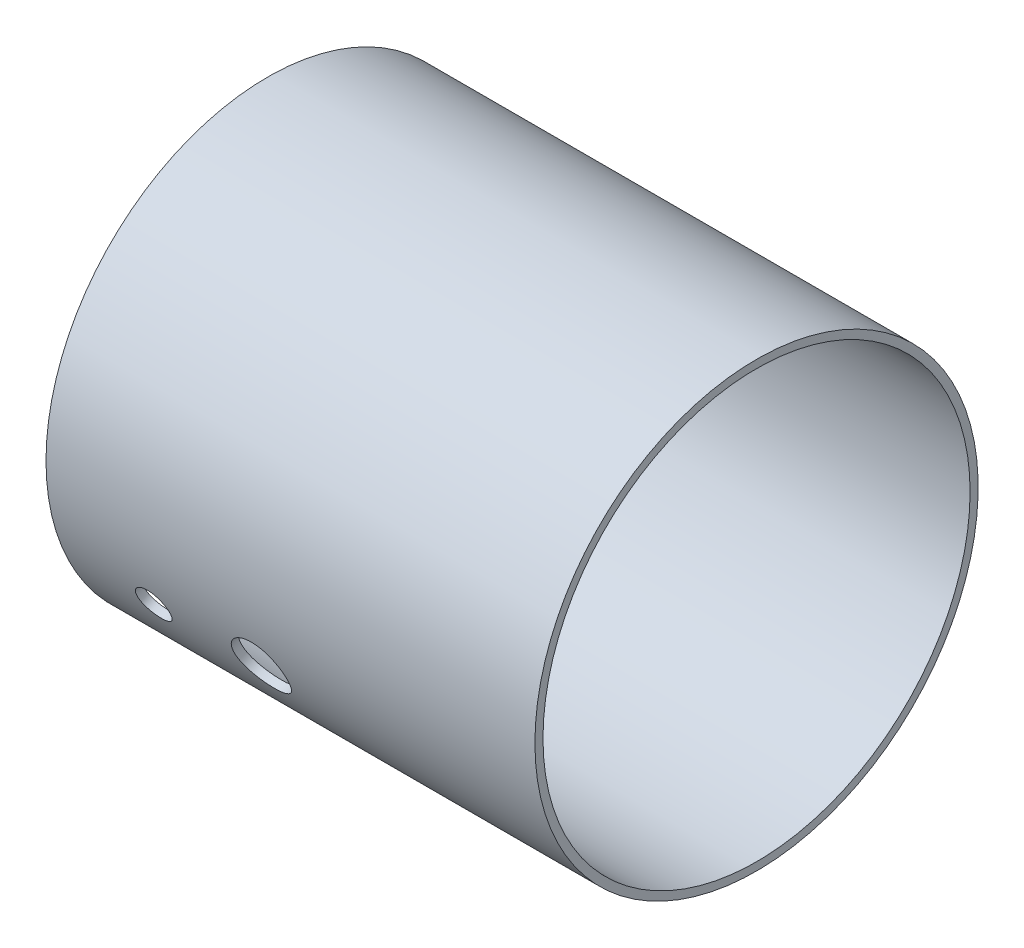
ISO-10303-21;
HEADER;
FILE_DESCRIPTION(('STEP AP214'),'2;1');
FILE_NAME('part.step','',(''),(''),'','','');
FILE_SCHEMA(('AUTOMOTIVE_DESIGN { 1 0 10303 214 1 1 1 1 }'));
ENDSEC;
DATA;
#1=APPLICATION_CONTEXT('core data for automotive mechanical design processes');
#2=APPLICATION_PROTOCOL_DEFINITION('international standard','automotive_design',2000,#1);
#3=PRODUCT_CONTEXT('',#1,'mechanical');
#4=PRODUCT('Part','Part','',(#3));
#5=PRODUCT_RELATED_PRODUCT_CATEGORY('part','',(#4));
#6=PRODUCT_DEFINITION_FORMATION('','',#4);
#7=PRODUCT_DEFINITION_CONTEXT('part definition',#1,'design');
#8=PRODUCT_DEFINITION('design','',#6,#7);
#9=PRODUCT_DEFINITION_SHAPE('','',#8);
#10=(LENGTH_UNIT() NAMED_UNIT(*) SI_UNIT(.MILLI.,.METRE.));
#11=(NAMED_UNIT(*) PLANE_ANGLE_UNIT() SI_UNIT($,.RADIAN.));
#12=(NAMED_UNIT(*) SI_UNIT($,.STERADIAN.) SOLID_ANGLE_UNIT());
#13=UNCERTAINTY_MEASURE_WITH_UNIT(LENGTH_MEASURE(1.E-05),#10,'distance_accuracy_value','');
#14=(GEOMETRIC_REPRESENTATION_CONTEXT(3) GLOBAL_UNCERTAINTY_ASSIGNED_CONTEXT((#13)) GLOBAL_UNIT_ASSIGNED_CONTEXT((#10,
#11,#12)) REPRESENTATION_CONTEXT('',''));
#15=CARTESIAN_POINT('',(0.,0.,0.));
#16=DIRECTION('',(0.,0.,1.));
#17=DIRECTION('',(1.,0.,0.));
#18=AXIS2_PLACEMENT_3D('',#15,#16,#17);
#19=CARTESIAN_POINT('',(-120.01793217917,0.,0.));
#20=DIRECTION('',(-1.,0.,0.));
#21=DIRECTION('',(0.,0.,1.));
#22=AXIS2_PLACEMENT_3D('',#19,#20,#21);
#23=CYLINDRICAL_SURFACE('',#22,79.5);
#24=CARTESIAN_POINT('',(182.,0.,0.));
#25=DIRECTION('',(-1.,0.,0.));
#26=DIRECTION('',(0.,0.,1.));
#27=AXIS2_PLACEMENT_3D('',#24,#25,#26);
#28=CIRCLE('',#27,79.5);
#29=CARTESIAN_POINT('',(182.,0.,79.5));
#30=VERTEX_POINT('',#29);
#31=EDGE_CURVE('E47',#30,#30,#28,.T.);
#32=ORIENTED_EDGE('',*,*,#31,.F.);
#33=EDGE_LOOP('',(#32));
#34=FACE_BOUND('',#33,.T.);
#35=CARTESIAN_POINT('',(0.,0.,0.));
#36=DIRECTION('',(-1.,0.,0.));
#37=DIRECTION('',(0.,0.,1.));
#38=AXIS2_PLACEMENT_3D('',#35,#36,#37);
#39=CIRCLE('',#38,79.5);
#40=CARTESIAN_POINT('',(0.,0.,79.5));
#41=VERTEX_POINT('',#40);
#42=EDGE_CURVE('E10',#41,#41,#39,.T.);
#43=ORIENTED_EDGE('',*,*,#42,.T.);
#44=EDGE_LOOP('',(#43));
#45=FACE_BOUND('',#44,.T.);
#46=CARTESIAN_POINT('',(33.0000000000002,-26.339565342706,75.0098480038277));
#47=CARTESIAN_POINT('',(33.1780990960392,-26.3395637631079,75.0098483234516));
#48=CARTESIAN_POINT('',(33.3561735519873,-26.3466607333371,75.0073575387973));
#49=CARTESIAN_POINT('',(33.7111118902623,-26.3749916611363,74.9974002817584));
#50=CARTESIAN_POINT('',(33.8879754610085,-26.3962291286621,74.9899325740011));
#51=CARTESIAN_POINT('',(34.2393184216277,-26.4527005304754,74.9700308625018));
#52=CARTESIAN_POINT('',(34.4137957046992,-26.487946098947,74.9575927306137));
#53=CARTESIAN_POINT('',(34.7590423343135,-26.5721679758415,74.9277777842344));
#54=CARTESIAN_POINT('',(34.9298102999027,-26.6211493066967,74.9103991632389));
#55=CARTESIAN_POINT('',(35.2662020689658,-26.7323978056422,74.8707712506039));
#56=CARTESIAN_POINT('',(35.4318305089475,-26.7946525751679,74.8485265038552));
#57=CARTESIAN_POINT('',(35.756999419303,-26.9320118281662,74.7992116417414));
#58=CARTESIAN_POINT('',(35.916537621898,-27.0071210421622,74.7721397497998));
#59=CARTESIAN_POINT('',(36.2282446842993,-27.1695403471367,74.7132754609648));
#60=CARTESIAN_POINT('',(36.3804178260089,-27.2568432313759,74.6814858516618));
#61=CARTESIAN_POINT('',(36.6764808492024,-27.4430442236708,74.613263930124));
#62=CARTESIAN_POINT('',(36.8203676452818,-27.5419466096858,74.5768299045699));
#63=CARTESIAN_POINT('',(37.0990279357938,-27.7507443953443,74.4993865802986));
#64=CARTESIAN_POINT('',(37.2337852167798,-27.8606585355086,74.4583694676272));
#65=CARTESIAN_POINT('',(37.4930112593986,-28.0905414370194,74.3719474091262));
#66=CARTESIAN_POINT('',(37.6174762009992,-28.2105138985668,74.3265408475815));
#67=CARTESIAN_POINT('',(37.8551448020757,-28.4595298325317,74.231549284308));
#68=CARTESIAN_POINT('',(37.968352109962,-28.5885703428564,74.1819656459858));
#69=CARTESIAN_POINT('',(38.1827903937638,-28.8548362943468,74.0788013623981));
#70=CARTESIAN_POINT('',(38.2840169342014,-28.9920647387164,74.0252192487266));
#71=CARTESIAN_POINT('',(38.4738173168941,-29.2737741742691,73.9142684338173));
#72=CARTESIAN_POINT('',(38.5623789111018,-29.4182620058702,73.856896144495));
#73=CARTESIAN_POINT('',(38.726130588582,-29.7133427722454,73.7386773540787));
#74=CARTESIAN_POINT('',(38.8013157127596,-29.8639379459093,73.6778295755052));
#75=CARTESIAN_POINT('',(38.9377078128981,-30.1700230892288,73.5530215477795));
#76=CARTESIAN_POINT('',(38.9989201231033,-30.3255111650947,73.4890624977327));
#77=CARTESIAN_POINT('',(39.106979273493,-30.6402906238045,73.358378788494));
#78=CARTESIAN_POINT('',(39.1538208159005,-30.799583385975,73.2916531196548));
#79=CARTESIAN_POINT('',(39.2719963574666,-31.2806151348121,73.0882579658533));
#80=CARTESIAN_POINT('',(39.3214259882023,-31.6065089234031,72.9479631331041));
#81=CARTESIAN_POINT('',(39.3600200520946,-32.2591611328966,72.6617075218771));
#82=CARTESIAN_POINT('',(39.3491855240794,-32.5859195387978,72.5157468411097));
#83=CARTESIAN_POINT('',(39.2677411084826,-33.2304912099966,72.2226381059058));
#84=CARTESIAN_POINT('',(39.1972676137627,-33.548323177665,72.0754935189524));
#85=CARTESIAN_POINT('',(38.9987368040019,-34.166951202184,71.7843049505259));
#86=CARTESIAN_POINT('',(38.8706789789791,-34.4677471081321,71.6402609965245));
#87=CARTESIAN_POINT('',(38.5604676951755,-35.0444995586685,71.3599053100595));
#88=CARTESIAN_POINT('',(38.3782530014024,-35.3204275224174,71.2236025394404));
#89=CARTESIAN_POINT('',(37.964943357704,-35.8397419930519,70.9637044699875));
#90=CARTESIAN_POINT('',(37.7338474981838,-36.0831278942478,70.8401094076862));
#91=CARTESIAN_POINT('',(37.2285666579649,-36.53164601846,70.6098627058923));
#92=CARTESIAN_POINT('',(36.9542631526665,-36.7366695198328,70.5032593448473));
#93=CARTESIAN_POINT('',(36.3707668416944,-37.1023075562753,70.3115320105905));
#94=CARTESIAN_POINT('',(36.0615740105371,-37.2629220589076,70.2264080530679));
#95=CARTESIAN_POINT('',(35.4169938650973,-37.5356126725107,70.0810372307082));
#96=CARTESIAN_POINT('',(35.0816036899676,-37.6476834735577,70.0207930873682));
#97=CARTESIAN_POINT('',(34.3941882254255,-37.8203590338976,69.9276780021309));
#98=CARTESIAN_POINT('',(34.0421632570953,-37.8809647861333,69.8948065321182));
#99=CARTESIAN_POINT('',(33.3325112409311,-37.9490457914985,69.8578660564154));
#100=CARTESIAN_POINT('',(32.9749023409247,-37.9566672546407,69.853717789246));
#101=CARTESIAN_POINT('',(32.2633195997267,-37.9189701218964,69.8741879881071));
#102=CARTESIAN_POINT('',(31.9093457274518,-37.8736519790823,69.8988062079457));
#103=CARTESIAN_POINT('',(31.2155556904357,-37.7313425923171,69.975726127508));
#104=CARTESIAN_POINT('',(30.8757214711428,-37.6344195697941,70.0279912775187));
#105=CARTESIAN_POINT('',(30.2192984928643,-37.3914321570582,70.1580336066324));
#106=CARTESIAN_POINT('',(29.9027100770876,-37.2453670414722,70.2358111623169));
#107=CARTESIAN_POINT('',(29.301006236715,-36.9074657847723,70.4139573530232));
#108=CARTESIAN_POINT('',(29.0159610568388,-36.7155303797096,70.5143749543667));
#109=CARTESIAN_POINT('',(28.4861447247059,-36.2909993397547,70.7337989043113));
#110=CARTESIAN_POINT('',(28.241374209797,-36.0584030615233,70.8528055470264));
#111=CARTESIAN_POINT('',(27.7984900341628,-35.5580252593456,71.1052417568787));
#112=CARTESIAN_POINT('',(27.6004840116602,-35.2901647306107,71.2387035862052));
#113=CARTESIAN_POINT('',(27.2574895079495,-34.7267637669536,71.5150344517637));
#114=CARTESIAN_POINT('',(27.1125005340849,-34.4312235892745,71.6579034005662));
#115=CARTESIAN_POINT('',(26.8798342286508,-33.8208970582072,71.9479740113309));
#116=CARTESIAN_POINT('',(26.7920900523433,-33.5061336234173,72.0951704093797));
#117=CARTESIAN_POINT('',(26.6762112728436,-32.8655490990919,72.3894299208992));
#118=CARTESIAN_POINT('',(26.6480756421724,-32.5397282002535,72.5364930366236));
#119=CARTESIAN_POINT('',(26.651117563786,-32.0505458762944,72.7533131795582));
#120=CARTESIAN_POINT('',(26.6596457968045,-31.8875498471016,72.824897724091));
#121=CARTESIAN_POINT('',(26.6916205803092,-31.5623331886902,72.9664337837344));
#122=CARTESIAN_POINT('',(26.7150616048534,-31.4001122946684,73.0363858937951));
#123=CARTESIAN_POINT('',(26.7767104916502,-31.0775504372601,73.1742213123495));
#124=CARTESIAN_POINT('',(26.8149237893291,-30.9172101882535,73.2421038494179));
#125=CARTESIAN_POINT('',(26.9058208263609,-30.5996776301527,73.3753320616873));
#126=CARTESIAN_POINT('',(26.9584992548417,-30.4424841883903,73.4406786579285));
#127=CARTESIAN_POINT('',(27.0779738730102,-30.1322859461452,73.5684952842261));
#128=CARTESIAN_POINT('',(27.1447745354317,-29.9792824900792,73.6309643952858));
#129=CARTESIAN_POINT('',(27.2919782981715,-29.6786926875176,73.7526371271066));
#130=CARTESIAN_POINT('',(27.372376407136,-29.5311043773349,73.8118419355921));
#131=CARTESIAN_POINT('',(27.5462503182698,-29.2423232977976,73.9267251326737));
#132=CARTESIAN_POINT('',(27.6397306298084,-29.1011327560312,73.9824022956536));
#133=CARTESIAN_POINT('',(27.8390491190915,-28.8262980377158,74.0899204444065));
#134=CARTESIAN_POINT('',(27.9448827746423,-28.6926511260816,74.1417628226974));
#135=CARTESIAN_POINT('',(28.1685274693609,-28.433451289354,74.2415530285917));
#136=CARTESIAN_POINT('',(28.2863737500718,-28.3079240545632,74.2894886088057));
#137=CARTESIAN_POINT('',(28.5328980739968,-28.066397157741,74.3810730631424));
#138=CARTESIAN_POINT('',(28.6615721326326,-27.9503940216592,74.4247235014787));
#139=CARTESIAN_POINT('',(28.9289644188099,-27.7286758454477,74.5076140842716));
#140=CARTESIAN_POINT('',(29.067688742049,-27.6229671417689,74.5468515146968));
#141=CARTESIAN_POINT('',(29.354080424556,-27.4227644881333,74.6207301822976));
#142=CARTESIAN_POINT('',(29.5017444646058,-27.3282664138962,74.6553731103022));
#143=CARTESIAN_POINT('',(29.8053440496595,-27.1509797575773,74.7200322837832));
#144=CARTESIAN_POINT('',(29.9612965252871,-27.0682165173213,74.750038528339));
#145=CARTESIAN_POINT('',(30.2800177733364,-26.9153134870297,74.8052304803821));
#146=CARTESIAN_POINT('',(30.4427840259777,-26.8451690804207,74.8304179510225));
#147=CARTESIAN_POINT('',(30.773893490301,-26.7180718743163,74.8758919307544));
#148=CARTESIAN_POINT('',(30.9422318573503,-26.6611079425192,74.8961825763591));
#149=CARTESIAN_POINT('',(31.2833588052983,-26.5607607707999,74.9318277910881));
#150=CARTESIAN_POINT('',(31.4561462534149,-26.5173741102539,74.9471836035084));
#151=CARTESIAN_POINT('',(31.8551756925454,-26.4340302833858,74.9766267646965));
#152=CARTESIAN_POINT('',(32.0825090839352,-26.3986420708291,74.9890813166293));
#153=CARTESIAN_POINT('',(32.5399086888493,-26.3514106491849,75.0056917196992));
#154=CARTESIAN_POINT('',(32.7699748957273,-26.3395673828467,75.0098475910151));
#155=CARTESIAN_POINT('',(33.0000000000002,-26.339565342706,75.0098480038277));
#156=B_SPLINE_CURVE_WITH_KNOTS('',3,(#46,#47,#48,#49,#50,#51,#52,#53,#54,#55,#56,#57,#58,#59,
#60,#61,#62,#63,#64,#65,#66,#67,#68,#69,#70,#71,#72,#73,#74,#75,#76,#77,#78,#79,#80,#81,#82,#83,
#84,#85,#86,#87,#88,#89,#90,#91,#92,#93,#94,#95,#96,#97,#98,#99,#100,#101,#102,#103,#104,#105,
#106,#107,#108,#109,#110,#111,#112,#113,#114,#115,#116,#117,#118,#119,#120,#121,#122,#123,#124,
#125,#126,#127,#128,#129,#130,#131,#132,#133,#134,#135,#136,#137,#138,#139,#140,#141,#142,#143,
#144,#145,#146,#147,#148,#149,#150,#151,#152,#153,#154,#155),.UNSPECIFIED.,.T.,.F.,(4,2,2,2,2,2,
2,2,2,2,2,2,2,2,2,2,2,2,2,2,2,2,2,2,2,2,2,2,2,2,2,2,2,2,2,2,2,2,2,2,2,2,2,2,2,2,2,2,2,2,2,2,2,2,
4),(0.,0.534096216068249,1.06832505500291,1.60299851868933,2.13786773929535,2.67223951665104,
3.20680837099547,3.74106260935773,4.27551450687686,4.81089194014471,5.34646719671105,
5.88186831274489,6.41746702717752,6.95358025685408,7.48989182894925,8.02599831569972,
8.56230220103951,9.6314477901735,10.7005749495288,11.7672636282901,12.8339617541093,
13.9018706103609,14.9697993403184,16.0407102696176,17.1116219811323,18.1826508041185,
19.2536589627034,20.3217104996567,21.3897528959847,22.4563868379419,23.5230365248857,
24.5920156976694,25.6610117854509,26.7324449198234,27.8038680977392,28.8740379250771,
29.9441893056287,30.4783500434018,31.0123129628627,31.5464725401299,32.0804362623472,
32.6145693533148,33.1485067984591,33.682628744551,34.2165557740204,34.7520969155946,
35.2874418349073,35.8231142153032,36.3585889119208,36.8952029263956,37.4316202207581,
37.9675827867253,38.5034102147109,39.1932275088758,39.883043125716),.UNSPECIFIED.);
#157=CARTESIAN_POINT('',(33.0000000000002,-26.339565342706,75.0098480038277));
#158=VERTEX_POINT('',#157);
#159=EDGE_CURVE('E67',#158,#158,#156,.T.);
#160=ORIENTED_EDGE('',*,*,#159,.F.);
#161=EDGE_LOOP('',(#160));
#162=FACE_BOUND('',#161,.T.);
#163=CARTESIAN_POINT('',(73.0000000000001,-22.4636112990738,76.2603184323546));
#164=CARTESIAN_POINT('',(73.2908440333992,-22.4636076186002,76.2603186963325));
#165=CARTESIAN_POINT('',(73.5816376489165,-22.475421323408,76.2568423757306));
#166=CARTESIAN_POINT('',(74.1612360159097,-22.5225697070572,76.2429307494915));
#167=CARTESIAN_POINT('',(74.4500403088614,-22.5579096365573,76.2324938903779));
#168=CARTESIAN_POINT('',(75.0237588923989,-22.6518560794304,76.2046311280473));
#169=CARTESIAN_POINT('',(75.308669424037,-22.7104836304115,76.1871989052009));
#170=CARTESIAN_POINT('',(75.872322038034,-22.8505002628887,76.1453214136557));
#171=CARTESIAN_POINT('',(76.1510639927321,-22.9318898149783,76.1208759999621));
#172=CARTESIAN_POINT('',(76.7002041967344,-23.1166712408734,76.0649644212271));
#173=CARTESIAN_POINT('',(76.9706083290552,-23.2200471749742,76.0335033416119));
#174=CARTESIAN_POINT('',(77.5013961338517,-23.4479733477474,75.9635224861747));
#175=CARTESIAN_POINT('',(77.7617796766781,-23.5725238602697,75.9250026190611));
#176=CARTESIAN_POINT('',(78.2706691380458,-23.8417503699105,75.8408914391128));
#177=CARTESIAN_POINT('',(78.519177189519,-23.9864227345934,75.7953014024284));
#178=CARTESIAN_POINT('',(79.0026533337046,-24.2947428755549,75.697038494138));
#179=CARTESIAN_POINT('',(79.2376213400533,-24.4583907728468,75.6443655773618));
#180=CARTESIAN_POINT('',(79.6936457208415,-24.8043071749154,75.5316463814133));
#181=CARTESIAN_POINT('',(79.9146190218711,-24.9866725831138,75.4715613681047));
#182=CARTESIAN_POINT('',(80.339709602815,-25.3678348211333,75.3442984878019));
#183=CARTESIAN_POINT('',(80.5438268114087,-25.5666317204711,75.2771205907993));
#184=CARTESIAN_POINT('',(80.9337948629668,-25.9791212916562,75.1357623237385));
#185=CARTESIAN_POINT('',(81.1196445744752,-26.1928148847785,75.0615815204901));
#186=CARTESIAN_POINT('',(81.4717552520092,-26.6334356717905,74.9063725635146));
#187=CARTESIAN_POINT('',(81.6380166657677,-26.8603625630272,74.8253445663677));
#188=CARTESIAN_POINT('',(81.9503475735272,-27.3265727794846,74.6563467503727));
#189=CARTESIAN_POINT('',(82.0963411176714,-27.5658981996164,74.5683526631861));
#190=CARTESIAN_POINT('',(82.3663598524721,-28.0543115822826,74.3859767932547));
#191=CARTESIAN_POINT('',(82.4903849726118,-28.3033995761511,74.2915949900072));
#192=CARTESIAN_POINT('',(82.7155545067896,-28.8094368456178,74.0968274557237));
#193=CARTESIAN_POINT('',(82.816699642239,-29.0663858730659,73.9964419141131));
#194=CARTESIAN_POINT('',(82.9953627446139,-29.5862087810022,73.7901377890044));
#195=CARTESIAN_POINT('',(83.0728808566071,-29.849082625102,73.6842192394832));
#196=CARTESIAN_POINT('',(83.2033330539782,-30.3772603793375,73.4680407195221));
#197=CARTESIAN_POINT('',(83.2564054546767,-30.6425417356642,73.3578091016287));
#198=CARTESIAN_POINT('',(83.3382199606585,-31.1750496518697,73.133096401218));
#199=CARTESIAN_POINT('',(83.3669621493231,-31.4422762050791,73.0186153332652));
#200=CARTESIAN_POINT('',(83.399898661356,-31.976710239525,72.7861587941327));
#201=CARTESIAN_POINT('',(83.4040939156661,-32.2439177211004,72.6681834556436));
#202=CARTESIAN_POINT('',(83.3879072204003,-32.776393361227,72.429573752238));
#203=CARTESIAN_POINT('',(83.3675253512558,-33.0416615261218,72.3089393960247));
#204=CARTESIAN_POINT('',(83.3025386504136,-33.5667587607644,72.0666761003829));
#205=CARTESIAN_POINT('',(83.2580828334327,-33.8266111829234,71.9450577667773));
#206=CARTESIAN_POINT('',(83.1453774113024,-34.340744171889,71.7010757138381));
#207=CARTESIAN_POINT('',(83.0771279190378,-34.5950247651241,71.5787119980436));
#208=CARTESIAN_POINT('',(82.9173367088881,-35.0963011790024,71.334265327983));
#209=CARTESIAN_POINT('',(82.8257946617906,-35.3432968966276,71.2121823777099));
#210=CARTESIAN_POINT('',(82.6200852235322,-35.8283703878768,70.9693697869226));
#211=CARTESIAN_POINT('',(82.5059177321579,-36.0664481219954,70.848640152405));
#212=CARTESIAN_POINT('',(82.2554117637436,-36.53283167283,70.6092849487063));
#213=CARTESIAN_POINT('',(82.1190093802861,-36.7611068526188,70.4906665711546));
#214=CARTESIAN_POINT('',(81.8252450437563,-37.2056950124273,70.2570233632009));
#215=CARTESIAN_POINT('',(81.6678830649842,-37.4220079777792,70.1419985372053));
#216=CARTESIAN_POINT('',(81.3333004198112,-37.8413381655342,69.9166631993616));
#217=CARTESIAN_POINT('',(81.1560789111962,-38.0443548234811,69.8063528877235));
#218=CARTESIAN_POINT('',(80.7830167016722,-38.4358450809562,69.5915632465786));
#219=CARTESIAN_POINT('',(80.5871759052205,-38.624318605849,69.4870839469974));
#220=CARTESIAN_POINT('',(80.1766947752138,-38.986942837715,69.2842823347932));
#221=CARTESIAN_POINT('',(79.9619245810232,-39.1609756514748,69.186012018183));
#222=CARTESIAN_POINT('',(79.5163566138906,-39.4920750622511,68.9975528997378));
#223=CARTESIAN_POINT('',(79.285558756096,-39.6491415694343,68.9073641406934));
#224=CARTESIAN_POINT('',(78.8095436388696,-39.9453619073277,68.7360701980717));
#225=CARTESIAN_POINT('',(78.5643262829934,-40.0845156182086,68.6549650752607));
#226=CARTESIAN_POINT('',(78.0611882889654,-40.3440689919326,68.5027644831228));
#227=CARTESIAN_POINT('',(77.8032676771066,-40.4644686935901,68.4316689930795));
#228=CARTESIAN_POINT('',(77.2764029112327,-40.6858399366759,68.3002856087156));
#229=CARTESIAN_POINT('',(77.0074532955876,-40.7868017078857,68.240003150457));
#230=CARTESIAN_POINT('',(76.4605570473094,-40.9686047321554,68.1310110638017));
#231=CARTESIAN_POINT('',(76.1826104040049,-41.0494459613492,68.0823014491322));
#232=CARTESIAN_POINT('',(75.6197180897739,-41.1905060862727,67.9970514587448));
#233=CARTESIAN_POINT('',(75.3347727228228,-41.2507258759615,67.9605105555036));
#234=CARTESIAN_POINT('',(74.7599232465584,-41.3501731195173,67.9000484200178));
#235=CARTESIAN_POINT('',(74.4700191697484,-41.3894007109292,67.8761271050873));
#236=CARTESIAN_POINT('',(73.8895052680405,-41.4464070698075,67.8413328967628));
#237=CARTESIAN_POINT('',(73.5989164834042,-41.4643421704698,67.8303649009744));
#238=CARTESIAN_POINT('',(73.0170027463713,-41.4791769040875,67.8212942983545));
#239=CARTESIAN_POINT('',(72.7256777975859,-41.476076640029,67.8231916285364));
#240=CARTESIAN_POINT('',(72.1443864665952,-41.4488603188831,67.8398277627499));
#241=CARTESIAN_POINT('',(71.8544200541938,-41.4247447311516,67.8545662799867));
#242=CARTESIAN_POINT('',(71.2779139025845,-41.3556476438994,67.8967012582395));
#243=CARTESIAN_POINT('',(70.9913741612158,-41.3106661575367,67.9240977112736));
#244=CARTESIAN_POINT('',(70.4248218006016,-41.2003207567509,67.9910855411478));
#245=CARTESIAN_POINT('',(70.1447888292278,-41.1350334595033,68.0306310707672));
#246=CARTESIAN_POINT('',(69.5921175482063,-40.9844198759799,68.1214727832802));
#247=CARTESIAN_POINT('',(69.3194792139945,-40.8990936562799,68.1727689271344));
#248=CARTESIAN_POINT('',(68.7834885596779,-40.708912628979,68.2865045231278));
#249=CARTESIAN_POINT('',(68.5201365146073,-40.6040572435546,68.3489443049795));
#250=CARTESIAN_POINT('',(68.0045467504253,-40.3754448057649,68.4842397106149));
#251=CARTESIAN_POINT('',(67.7523090974672,-40.251687640915,68.5570953963836));
#252=CARTESIAN_POINT('',(67.2592618192434,-39.9852377455851,68.7128423364831));
#253=CARTESIAN_POINT('',(67.0185265484495,-39.8424398563349,68.795789081387));
#254=CARTESIAN_POINT('',(66.5517172508796,-39.5393179313399,68.9704496367401));
#255=CARTESIAN_POINT('',(66.3256432735398,-39.3789938365037,69.0621634767483));
#256=CARTESIAN_POINT('',(65.889709170444,-39.0417705446223,69.2533588412041));
#257=CARTESIAN_POINT('',(65.6798496678545,-38.8648707111038,69.3528406639013));
#258=CARTESIAN_POINT('',(65.2778058809309,-38.4955630991233,69.5585097747991));
#259=CARTESIAN_POINT('',(65.0856216295711,-38.3031552917314,69.6646970755084));
#260=CARTESIAN_POINT('',(64.7191180621286,-37.9027444582313,69.8833621914351));
#261=CARTESIAN_POINT('',(64.5449183984438,-37.6946511596439,69.9958752941739));
#262=CARTESIAN_POINT('',(64.217008274181,-37.2652377779264,70.2254321111829));
#263=CARTESIAN_POINT('',(64.0632979122398,-37.0439176311288,70.3424758472604));
#264=CARTESIAN_POINT('',(63.777474247272,-36.5894596285133,70.5799345545292));
#265=CARTESIAN_POINT('',(63.6453606169056,-36.3563219518828,70.7003494745913));
#266=CARTESIAN_POINT('',(63.403690724441,-35.8797394452116,70.9433988302161));
#267=CARTESIAN_POINT('',(63.2941343587943,-35.6362946624915,71.0660332555875));
#268=CARTESIAN_POINT('',(63.0986732952354,-35.1414381231724,71.3120287568477));
#269=CARTESIAN_POINT('',(63.0127005114497,-34.890051688353,71.4353866679746));
#270=CARTESIAN_POINT('',(62.864623965555,-34.3803386989011,71.6820931016104));
#271=CARTESIAN_POINT('',(62.8025201740465,-34.1220121528172,71.8054416241307));
#272=CARTESIAN_POINT('',(62.7026506493377,-33.6002167782707,72.0510831101523));
#273=CARTESIAN_POINT('',(62.6648839034897,-33.3367481642362,72.1733761173639));
#274=CARTESIAN_POINT('',(62.6139707625336,-32.8065189594951,72.4159326651279));
#275=CARTESIAN_POINT('',(62.6008242341008,-32.5397583866233,72.5361962166668));
#276=CARTESIAN_POINT('',(62.599256780732,-32.0068616681684,72.7729013795744));
#277=CARTESIAN_POINT('',(62.6106518668419,-31.7407357466471,72.8893648318616));
#278=CARTESIAN_POINT('',(62.6577079255579,-31.2090410898496,73.1185993215889));
#279=CARTESIAN_POINT('',(62.6933687687535,-30.9434723516095,73.2313703787173));
#280=CARTESIAN_POINT('',(62.7886897401382,-30.4148216499159,73.4525065718073));
#281=CARTESIAN_POINT('',(62.8483497707414,-30.1517396763552,73.5608717256821));
#282=CARTESIAN_POINT('',(62.9912270237788,-29.629988198685,73.7725766568043));
#283=CARTESIAN_POINT('',(63.0744442953707,-29.3713187037844,73.8759164235645));
#284=CARTESIAN_POINT('',(63.2637848320342,-28.8604102155754,74.0770009085013));
#285=CARTESIAN_POINT('',(63.3698982327129,-28.6081685051335,74.1747480133045));
#286=CARTESIAN_POINT('',(63.6042840300186,-28.1118683819148,74.3642617300358));
#287=CARTESIAN_POINT('',(63.7325564046689,-27.8678099610223,74.4560283478951));
#288=CARTESIAN_POINT('',(64.010314735207,-27.3897436023094,74.6332159802386));
#289=CARTESIAN_POINT('',(64.1597961345909,-27.1557335197545,74.7186383517182));
#290=CARTESIAN_POINT('',(64.4790119384055,-26.6993562488208,74.8829301762971));
#291=CARTESIAN_POINT('',(64.6487554204927,-26.47699434364,74.9617966652377));
#292=CARTESIAN_POINT('',(65.0085439803944,-26.0441580650025,75.1132797215272));
#293=CARTESIAN_POINT('',(65.1987256524889,-25.8337801525401,75.1858475223713));
#294=CARTESIAN_POINT('',(65.5969638671107,-25.4283597323844,75.3239296165825));
#295=CARTESIAN_POINT('',(65.8050128278809,-25.2333107866705,75.3894468754263));
#296=CARTESIAN_POINT('',(66.2377074564538,-24.8598859990912,75.5134080870349));
#297=CARTESIAN_POINT('',(66.462360644471,-24.6815177959707,75.5718488027585));
#298=CARTESIAN_POINT('',(66.9266168593646,-24.342970671296,75.6815793584701));
#299=CARTESIAN_POINT('',(67.1662196963775,-24.18279151881,75.7328692892476));
#300=CARTESIAN_POINT('',(67.6597624403987,-23.8812686924017,75.8284916064946));
#301=CARTESIAN_POINT('',(67.9137590190278,-23.7400080723627,75.8727934567589));
#302=CARTESIAN_POINT('',(68.4333591590815,-23.4782991869255,75.9541852380191));
#303=CARTESIAN_POINT('',(68.6989625589294,-23.3578506319213,75.9912752693706));
#304=CARTESIAN_POINT('',(69.2396490718723,-23.1388800364554,76.0582365257401));
#305=CARTESIAN_POINT('',(69.5147229305372,-23.0403372549614,76.0881145815908));
#306=CARTESIAN_POINT('',(70.0725287233958,-22.8658980335717,76.1407183038097));
#307=CARTESIAN_POINT('',(70.3552588528389,-22.7899963065058,76.1634456400918));
#308=CARTESIAN_POINT('',(71.0270291555607,-22.6388410031055,76.2085379344856));
#309=CARTESIAN_POINT('',(71.4184751346575,-22.573210731727,76.2279621629534));
#310=CARTESIAN_POINT('',(72.2066453609022,-22.485598577596,76.2538521759847));
#311=CARTESIAN_POINT('',(72.603369562476,-22.463616318217,76.2603180723621));
#312=CARTESIAN_POINT('',(73.0000000000001,-22.4636112990738,76.2603184323546));
#313=B_SPLINE_CURVE_WITH_KNOTS('',3,(#163,#164,#165,#166,#167,#168,#169,#170,#171,#172,#173,
#174,#175,#176,#177,#178,#179,#180,#181,#182,#183,#184,#185,#186,#187,#188,#189,#190,#191,#192,
#193,#194,#195,#196,#197,#198,#199,#200,#201,#202,#203,#204,#205,#206,#207,#208,#209,#210,#211,
#212,#213,#214,#215,#216,#217,#218,#219,#220,#221,#222,#223,#224,#225,#226,#227,#228,#229,#230,
#231,#232,#233,#234,#235,#236,#237,#238,#239,#240,#241,#242,#243,#244,#245,#246,#247,#248,#249,
#250,#251,#252,#253,#254,#255,#256,#257,#258,#259,#260,#261,#262,#263,#264,#265,#266,#267,#268,
#269,#270,#271,#272,#273,#274,#275,#276,#277,#278,#279,#280,#281,#282,#283,#284,#285,#286,#287,
#288,#289,#290,#291,#292,#293,#294,#295,#296,#297,#298,#299,#300,#301,#302,#303,#304,#305,#306,
#307,#308,#309,#310,#311,#312),.UNSPECIFIED.,.T.,.F.,(4,2,2,2,2,2,2,2,2,2,2,2,2,2,2,2,2,2,2,2,2,
2,2,2,2,2,2,2,2,2,2,2,2,2,2,2,2,2,2,2,2,2,2,2,2,2,2,2,2,2,2,2,2,2,2,2,2,2,2,2,2,2,2,2,2,2,2,2,2,
2,2,2,2,2,4),(0.,0.872184867165447,1.74456445664867,2.6177339366957,3.49092147044131,
4.36347810482662,5.23604602481505,6.10845663111056,6.98087280136404,7.85805824708721,
8.73524740411602,9.61249085847218,10.4897142576378,11.3701409291512,12.2505704267111,
13.1309721602557,14.0113684881063,14.8867203682008,15.7620692483964,16.6373849308037,
17.5126977486507,18.3826534089978,19.2526049420532,20.1225687715215,20.9925364543524,
21.8650501301429,22.7375648757805,23.6101166375272,24.4826728769162,25.361766695942,
26.2408651693639,27.1199695232874,27.9990720577415,28.8786153144081,29.7581596143477,
30.6376657803805,31.5171661836585,32.3901683985628,33.2631663393835,34.1361447831837,
35.0091226764857,35.878845841403,36.7485661168532,37.618312129427,38.4880633180678,
39.3628340039766,40.2376076393575,41.112414877967,41.9872237485499,42.867521292114,
43.7478230733352,44.6281115106597,45.5083959069603,46.3861115129261,47.2638260378011,
48.1415040392167,49.0191772877694,49.8902935198113,50.7614051061865,51.6325131504721,
52.5036230125415,53.374358319023,54.2450927619371,55.1156404204844,55.9865795690565,
56.8637515646958,57.7405531654771,58.6177543407287,59.4949443776088,60.3758672434942,
61.2567778500893,62.136850797956,63.0167180687966,64.2061461152958,65.3955638985071),.UNSPECIFIED.);
#314=CARTESIAN_POINT('',(73.0000000000001,-22.4636112990738,76.2603184323546));
#315=VERTEX_POINT('',#314);
#316=EDGE_CURVE('E60',#315,#315,#313,.T.);
#317=ORIENTED_EDGE('',*,*,#316,.F.);
#318=EDGE_LOOP('',(#317));
#319=FACE_BOUND('',#318,.T.);
#320=ADVANCED_FACE('F40',(#34,#45,#162,#319),#23,.F.);
#321=CARTESIAN_POINT('',(-120.01793217917,0.,0.));
#322=DIRECTION('',(-1.,0.,0.));
#323=DIRECTION('',(0.,0.,1.));
#324=AXIS2_PLACEMENT_3D('',#321,#322,#323);
#325=CYLINDRICAL_SURFACE('',#324,82.5);
#326=CARTESIAN_POINT('',(0.,0.,0.));
#327=DIRECTION('',(-1.,0.,0.));
#328=DIRECTION('',(0.,0.,1.));
#329=AXIS2_PLACEMENT_3D('',#326,#327,#328);
#330=CIRCLE('',#329,82.5);
#331=CARTESIAN_POINT('',(0.,0.,82.5));
#332=VERTEX_POINT('',#331);
#333=EDGE_CURVE('E55',#332,#332,#330,.T.);
#334=ORIENTED_EDGE('',*,*,#333,.F.);
#335=EDGE_LOOP('',(#334));
#336=FACE_BOUND('',#335,.T.);
#337=CARTESIAN_POINT('',(182.,0.,0.));
#338=DIRECTION('',(-1.,0.,0.));
#339=DIRECTION('',(0.,0.,1.));
#340=AXIS2_PLACEMENT_3D('',#337,#338,#339);
#341=CIRCLE('',#340,82.5);
#342=CARTESIAN_POINT('',(182.,0.,82.5));
#343=VERTEX_POINT('',#342);
#344=EDGE_CURVE('E51',#343,#343,#341,.T.);
#345=ORIENTED_EDGE('',*,*,#344,.T.);
#346=EDGE_LOOP('',(#345));
#347=FACE_BOUND('',#346,.T.);
#348=CARTESIAN_POINT('',(33.0000000000002,-27.5601821817878,77.7604421161986));
#349=CARTESIAN_POINT('',(33.1781209815815,-27.5601806289933,77.7604424427568));
#350=CARTESIAN_POINT('',(33.3562175828737,-27.5672703973049,77.7579309120473));
#351=CARTESIAN_POINT('',(33.7112003701421,-27.5955729152458,77.7478912223093));
#352=CARTESIAN_POINT('',(33.8880862431998,-27.6167891863054,77.7403618124321));
#353=CARTESIAN_POINT('',(34.2394747142756,-27.6732052062141,77.7202972626823));
#354=CARTESIAN_POINT('',(34.4139751948426,-27.7084166377547,77.707757940657));
#355=CARTESIAN_POINT('',(34.7592680980599,-27.7925587256669,77.6777038429724));
#356=CARTESIAN_POINT('',(34.9300591398166,-27.8414943998754,77.660187247499));
#357=CARTESIAN_POINT('',(35.2664975257244,-27.9526423684748,77.6202503558377));
#358=CARTESIAN_POINT('',(35.4321494766249,-28.0148423540693,77.59783460541));
#359=CARTESIAN_POINT('',(35.7573641356019,-28.1520847772607,77.5481492182951));
#360=CARTESIAN_POINT('',(35.9169245754791,-28.2271319426022,77.5208777945781));
#361=CARTESIAN_POINT('',(36.228673617505,-28.3894221024335,77.4615915627368));
#362=CARTESIAN_POINT('',(36.3808665178135,-28.4766578678751,77.4295795655735));
#363=CARTESIAN_POINT('',(36.6769659370666,-28.6627219814,77.3608958211281));
#364=CARTESIAN_POINT('',(36.8208693699888,-28.7615546057341,77.3242223545481));
#365=CARTESIAN_POINT('',(37.0995389288129,-28.9701975119733,77.2462948776724));
#366=CARTESIAN_POINT('',(37.2342901714011,-29.0800249887077,77.2050336811237));
#367=CARTESIAN_POINT('',(37.4935021019683,-29.3097335935865,77.1181210711754));
#368=CARTESIAN_POINT('',(37.6179589693451,-29.4296184214111,77.0724680412893));
#369=CARTESIAN_POINT('',(37.8556089287467,-29.678460502382,76.9769883227589));
#370=CARTESIAN_POINT('',(37.9688056738048,-29.8074147898661,76.9271629974251));
#371=CARTESIAN_POINT('',(38.1832201773099,-30.0735119255089,76.8235268082121));
#372=CARTESIAN_POINT('',(38.2844334991743,-30.2106577783078,76.7697144801512));
#373=CARTESIAN_POINT('',(38.474195608152,-30.4921940748783,76.6583265582947));
#374=CARTESIAN_POINT('',(38.5627333807636,-30.6365906738448,76.6007477541263));
#375=CARTESIAN_POINT('',(38.7264376947988,-30.9314956585726,76.4821407258476));
#376=CARTESIAN_POINT('',(38.8015992779755,-31.0820062853777,76.4211112336462));
#377=CARTESIAN_POINT('',(38.9379452517202,-31.3879314522731,76.2959699298871));
#378=CARTESIAN_POINT('',(38.9991349648581,-31.5433440991785,76.2318593033886));
#379=CARTESIAN_POINT('',(39.1071504655245,-31.8579837972398,76.1009067748455));
#380=CARTESIAN_POINT('',(39.1539709548131,-32.0172122320845,76.0340638756231));
#381=CARTESIAN_POINT('',(39.2720988564553,-32.4981202040956,75.8303536540752));
#382=CARTESIAN_POINT('',(39.3214961621854,-32.8239756713481,75.6899158799454));
#383=CARTESIAN_POINT('',(39.360019638556,-33.4766157166907,75.403537259458));
#384=CARTESIAN_POINT('',(39.3491467820095,-33.8034002796994,75.2575965019611));
#385=CARTESIAN_POINT('',(39.2676135277676,-34.4481426524481,74.9646617961969));
#386=CARTESIAN_POINT('',(39.1970798119313,-34.766117691703,74.8176707333526));
#387=CARTESIAN_POINT('',(38.998402944954,-35.3850823623712,74.5269278666312));
#388=CARTESIAN_POINT('',(38.8702593144205,-35.6860718524183,74.3831760897198));
#389=CARTESIAN_POINT('',(38.559863756734,-36.2632177152962,74.1035227457095));
#390=CARTESIAN_POINT('',(38.3775548533057,-36.5393475377884,73.9676296258288));
#391=CARTESIAN_POINT('',(37.9640437165357,-37.0590713966276,73.7086133193991));
#392=CARTESIAN_POINT('',(37.7328406395024,-37.3026648714266,73.5854903532596));
#393=CARTESIAN_POINT('',(37.2273898785611,-37.7515304022147,73.3562252111991));
#394=CARTESIAN_POINT('',(36.9530321275486,-37.9567014463371,73.2501278972363));
#395=CARTESIAN_POINT('',(36.3694441777859,-38.3226028560497,73.0593650800343));
#396=CARTESIAN_POINT('',(36.0602139560358,-38.4833331923292,72.9746995909304));
#397=CARTESIAN_POINT('',(35.4155838588579,-38.756204233358,72.8301489508454));
#398=CARTESIAN_POINT('',(35.08018140567,-38.8683401447906,72.7702662444451));
#399=CARTESIAN_POINT('',(34.3927630791482,-39.0410865395004,72.6777355772349));
#400=CARTESIAN_POINT('',(34.0407475033162,-39.1016979450911,72.645087128919));
#401=CARTESIAN_POINT('',(33.3310614895455,-39.1697330242725,72.6084260604688));
#402=CARTESIAN_POINT('',(32.9734078628918,-39.1772926588097,72.6043402402066));
#403=CARTESIAN_POINT('',(32.2617492725581,-39.1393883220915,72.6247803945834));
#404=CARTESIAN_POINT('',(31.9077442799357,-39.0939247717661,72.6493061420865));
#405=CARTESIAN_POINT('',(31.2138716333183,-38.9512414952917,72.7259050272675));
#406=CARTESIAN_POINT('',(30.8739872333484,-38.8540850783006,72.7779444679543));
#407=CARTESIAN_POINT('',(30.2174857322027,-38.6105596309895,72.907431669197));
#408=CARTESIAN_POINT('',(29.9008689503362,-38.4641899254523,72.9848797783652));
#409=CARTESIAN_POINT('',(29.299184773797,-38.1256569168631,73.1622904312025));
#410=CARTESIAN_POINT('',(29.0141827037001,-37.9334012909843,73.2622983428267));
#411=CARTESIAN_POINT('',(28.4844777403657,-37.5082240274663,73.4808826551398));
#412=CARTESIAN_POINT('',(28.2397754399096,-37.2753017917537,73.5994593289121));
#413=CARTESIAN_POINT('',(27.7970920107992,-36.7743388370072,73.8510432898187));
#414=CARTESIAN_POINT('',(27.5992107815001,-36.5062248918219,73.9840805642084));
#415=CARTESIAN_POINT('',(27.2564732879504,-35.942381576808,74.2596357302758));
#416=CARTESIAN_POINT('',(27.1116165611298,-35.6466524479142,74.4021535392355));
#417=CARTESIAN_POINT('',(26.8792054116615,-35.0360076877536,74.6916476607025));
#418=CARTESIAN_POINT('',(26.7915887337166,-34.721113309956,74.8386189468029));
#419=CARTESIAN_POINT('',(26.6759670350838,-34.0803583620324,75.1325699388808));
#420=CARTESIAN_POINT('',(26.6479610681992,-33.7544979660525,75.2795496446878));
#421=CARTESIAN_POINT('',(26.6511952028731,-33.2652921053207,75.4963735676706));
#422=CARTESIAN_POINT('',(26.6597901728546,-33.1022778840648,75.5679877444027));
#423=CARTESIAN_POINT('',(26.6919033356177,-32.7770471415864,75.7096197665732));
#424=CARTESIAN_POINT('',(26.715416002054,-32.6148303473693,75.77963819322));
#425=CARTESIAN_POINT('',(26.7772128053327,-32.2922984039113,75.9176414043352));
#426=CARTESIAN_POINT('',(26.815502382609,-32.131983977501,75.9856254298506));
#427=CARTESIAN_POINT('',(26.9065563153185,-31.8145239161734,76.1190889225116));
#428=CARTESIAN_POINT('',(26.9593153558903,-31.6573771404365,76.1845692992437));
#429=CARTESIAN_POINT('',(27.0789558565989,-31.3472904954998,76.3126826631834));
#430=CARTESIAN_POINT('',(27.1458419177684,-31.1943520152877,76.3753147146229));
#431=CARTESIAN_POINT('',(27.2932203901179,-30.8939105387006,76.4973370352212));
#432=CARTESIAN_POINT('',(27.3737078058327,-30.7464055708597,76.5567284840227));
#433=CARTESIAN_POINT('',(27.5477636328074,-30.4578081773318,76.6720032197106));
#434=CARTESIAN_POINT('',(27.6413365403895,-30.3167179780072,76.7278852911307));
#435=CARTESIAN_POINT('',(27.8408426773939,-30.0420990100445,76.8358253041912));
#436=CARTESIAN_POINT('',(27.9467713799942,-29.9085674985777,76.8878846350582));
#437=CARTESIAN_POINT('',(28.1705860335358,-29.6496371980792,76.9881052187515));
#438=CARTESIAN_POINT('',(28.2885049516864,-29.5242624757563,77.0362550317283));
#439=CARTESIAN_POINT('',(28.5351704959872,-29.283047687861,77.1282683558548));
#440=CARTESIAN_POINT('',(28.663913137021,-29.1672041438797,77.1721334318257));
#441=CARTESIAN_POINT('',(28.9314376612993,-28.9458094027429,77.2554471894879));
#442=CARTESIAN_POINT('',(29.0702256412259,-28.8402645488275,77.2948931515157));
#443=CARTESIAN_POINT('',(29.3567385380425,-28.6403906333399,77.3691759784199));
#444=CARTESIAN_POINT('',(29.5044601381913,-28.5460574473709,77.4040145387398));
#445=CARTESIAN_POINT('',(29.8081532033963,-28.3691073271113,77.469043217438));
#446=CARTESIAN_POINT('',(29.9641408162965,-28.2865145803596,77.4992237500497));
#447=CARTESIAN_POINT('',(30.282923120374,-28.1339445623855,77.554740372521));
#448=CARTESIAN_POINT('',(30.4457152956032,-28.0639626783203,77.5800782339553));
#449=CARTESIAN_POINT('',(30.7768665123751,-27.9371793364086,77.6258240154116));
#450=CARTESIAN_POINT('',(30.9452206996836,-27.8803667150769,77.646236111575));
#451=CARTESIAN_POINT('',(31.2863697723855,-27.7803077540151,77.6820913681587));
#452=CARTESIAN_POINT('',(31.4591635238669,-27.7370579867318,77.6975357840178));
#453=CARTESIAN_POINT('',(31.8577173953358,-27.6541074961704,77.72710488042));
#454=CARTESIAN_POINT('',(32.0845540514848,-27.6189211114144,77.7396025896715));
#455=CARTESIAN_POINT('',(32.5409406348374,-27.5719594807198,77.7562709878895));
#456=CARTESIAN_POINT('',(32.7704905559886,-27.5601841825682,77.7604416954273));
#457=CARTESIAN_POINT('',(33.0000000000002,-27.5601821817878,77.7604421161986));
#458=B_SPLINE_CURVE_WITH_KNOTS('',3,(#348,#349,#350,#351,#352,#353,#354,#355,#356,#357,#358,
#359,#360,#361,#362,#363,#364,#365,#366,#367,#368,#369,#370,#371,#372,#373,#374,#375,#376,#377,
#378,#379,#380,#381,#382,#383,#384,#385,#386,#387,#388,#389,#390,#391,#392,#393,#394,#395,#396,
#397,#398,#399,#400,#401,#402,#403,#404,#405,#406,#407,#408,#409,#410,#411,#412,#413,#414,#415,
#416,#417,#418,#419,#420,#421,#422,#423,#424,#425,#426,#427,#428,#429,#430,#431,#432,#433,#434,
#435,#436,#437,#438,#439,#440,#441,#442,#443,#444,#445,#446,#447,#448,#449,#450,#451,#452,#453,
#454,#455,#456,#457),.UNSPECIFIED.,.T.,.F.,(4,2,2,2,2,2,2,2,2,2,2,2,2,2,2,2,2,2,2,2,2,2,2,2,2,2,
2,2,2,2,2,2,2,2,2,2,2,2,2,2,2,2,2,2,2,2,2,2,2,2,2,2,2,2,4),(0.,0.534162334862093,
1.0684578746648,1.60320036639102,2.13813862531125,2.67258262452433,3.20722372286314,
3.74154906154599,4.27607205137455,4.81144444213951,5.3470146449906,5.88241052641004,
6.41800400990874,6.95406011220553,7.49031450621177,8.02636427254937,8.56261145508079,
9.63180842367145,10.700988134541,11.7679032678883,12.8348272795815,13.9028775827696,
14.9709463171642,16.0417847316204,17.1126238523461,18.1835685757929,19.2544941284121,
20.322674110106,21.3908456120003,22.4577119067388,23.5245928397153,24.5936387148232,
25.6627003134436,26.7340227415882,27.805335823614,28.8754817780311,29.9456107459701,
30.4798666389373,31.0139247292455,31.5481796322602,32.0822385572673,32.6164716890026,
33.1505090339278,33.684730333053,34.2187565194038,34.7542928981768,35.2896329576146,
35.825300693149,36.3607707605338,36.8973284876098,37.4336895506778,37.9695942680769,
38.5053634443179,39.193634824924,39.8819046704958),.UNSPECIFIED.);
#459=CARTESIAN_POINT('',(33.0000000000002,-27.5601821817878,77.7604421161986));
#460=VERTEX_POINT('',#459);
#461=EDGE_CURVE('E89',#460,#460,#458,.T.);
#462=ORIENTED_EDGE('',*,*,#461,.T.);
#463=EDGE_LOOP('',(#462));
#464=FACE_BOUND('',#463,.T.);
#465=CARTESIAN_POINT('',(73.0000000000002,-23.6906296991745,79.0253381166863));
#466=CARTESIAN_POINT('',(73.2909404565336,-23.6906261503472,79.0253384120558));
#467=CARTESIAN_POINT('',(73.5818316450594,-23.7024234090565,79.0218052080741));
#468=CARTESIAN_POINT('',(74.1616258664219,-23.7495073844434,79.0076675620097));
#469=CARTESIAN_POINT('',(74.4505284348213,-23.7847994119774,78.9970615211521));
#470=CARTESIAN_POINT('',(75.0244475851563,-23.8786218116653,78.9687521134295));
#471=CARTESIAN_POINT('',(75.3094603611996,-23.9371734611209,78.951042248024));
#472=CARTESIAN_POINT('',(75.8733168775592,-24.0770145288665,78.9085084661551));
#473=CARTESIAN_POINT('',(76.152160491661,-24.1583044118929,78.8836844042876));
#474=CARTESIAN_POINT('',(76.7015060974533,-24.3428698747857,78.826924284002));
#475=CARTESIAN_POINT('',(76.972013841172,-24.4461298871476,78.7949932606711));
#476=CARTESIAN_POINT('',(77.503003341928,-24.6738128381352,78.7239936160445));
#477=CARTESIAN_POINT('',(77.7634849671931,-24.7982360547901,78.6849249009777));
#478=CARTESIAN_POINT('',(78.2725597855333,-25.0672019597805,78.5996518752177));
#479=CARTESIAN_POINT('',(78.5211551766727,-25.2117409087253,78.5534488905669));
#480=CARTESIAN_POINT('',(79.0047922796856,-25.5197943354613,78.4539118661165));
#481=CARTESIAN_POINT('',(79.2398339112504,-25.6833089256695,78.40057778407));
#482=CARTESIAN_POINT('',(79.695900408433,-26.0288968963148,78.2865236944922));
#483=CARTESIAN_POINT('',(79.9168479573437,-26.211060383018,78.2257675236478));
#484=CARTESIAN_POINT('',(80.3418780141658,-26.5918161913357,78.0971553810702));
#485=CARTESIAN_POINT('',(80.5459604545619,-26.7904085787128,78.0292993809171));
#486=CARTESIAN_POINT('',(80.9358479180968,-27.2024915842551,77.886596961462));
#487=CARTESIAN_POINT('',(81.1216518268187,-27.4159831094454,77.8117501164796));
#488=CARTESIAN_POINT('',(81.4736591530172,-27.8562071962836,77.655239880802));
#489=CARTESIAN_POINT('',(81.6398630160254,-28.0829394567791,77.5735766451233));
#490=CARTESIAN_POINT('',(81.9520254500885,-28.5487096909252,77.4033774978418));
#491=CARTESIAN_POINT('',(82.0979135673888,-28.7877867310615,77.3148192523163));
#492=CARTESIAN_POINT('',(82.36772268248,-29.2757149028165,77.1313842556139));
#493=CARTESIAN_POINT('',(82.4916436148355,-29.5245660635474,77.0365074856167));
#494=CARTESIAN_POINT('',(82.7166089280918,-30.0301477987123,76.8408334611789));
#495=CARTESIAN_POINT('',(82.8176539813941,-30.2868781412977,76.7400363808664));
#496=CARTESIAN_POINT('',(82.9961237778865,-30.8062875413602,76.5330046500716));
#497=CARTESIAN_POINT('',(83.0735486556192,-31.0689665649439,76.4267700305659));
#498=CARTESIAN_POINT('',(83.2038510835477,-31.5968929050998,76.2100212723269));
#499=CARTESIAN_POINT('',(83.2568571577169,-31.8621190959791,76.0995329354966));
#500=CARTESIAN_POINT('',(83.3385311359061,-32.3945531277449,75.8744124457198));
#501=CARTESIAN_POINT('',(83.3671991174282,-32.6617609623185,75.7597803059699));
#502=CARTESIAN_POINT('',(83.3999808398655,-33.1961976375535,75.5271301954342));
#503=CARTESIAN_POINT('',(83.40409544965,-33.4634264771369,75.4091123446069));
#504=CARTESIAN_POINT('',(83.3877416721744,-33.9959862043099,75.1705265202618));
#505=CARTESIAN_POINT('',(83.3672733595514,-34.2613170976596,75.0499585544876));
#506=CARTESIAN_POINT('',(83.3020942169337,-34.7866961736974,74.8078802993212));
#507=CARTESIAN_POINT('',(83.257521845997,-35.0467658113465,74.6863792617008));
#508=CARTESIAN_POINT('',(83.1445561857083,-35.5613678228312,74.4427307896173));
#509=CARTESIAN_POINT('',(83.0761630012977,-35.8159002210555,74.3205833580041));
#510=CARTESIAN_POINT('',(82.9160571420171,-36.3177092335244,74.0766618559624));
#511=CARTESIAN_POINT('',(82.8243441563744,-36.5649857510241,73.9548877905314));
#512=CARTESIAN_POINT('',(82.6182656526377,-37.0506428061606,73.712777025199));
#513=CARTESIAN_POINT('',(82.5039000410388,-37.2890233070717,73.5924403312329));
#514=CARTESIAN_POINT('',(82.2529954557216,-37.7559805144557,73.3539696350769));
#515=CARTESIAN_POINT('',(82.1163968124268,-37.9845286857911,73.2358425415872));
#516=CARTESIAN_POINT('',(81.8222230694287,-38.4296708395038,73.0032429004002));
#517=CARTESIAN_POINT('',(81.6646479456513,-38.6462648081612,72.8887703568973));
#518=CARTESIAN_POINT('',(81.3296248020781,-39.0661540111353,72.6645874243082));
#519=CARTESIAN_POINT('',(81.152175999119,-39.2694487208668,72.5548772231285));
#520=CARTESIAN_POINT('',(80.7786479578665,-39.6614819476968,72.3413207387335));
#521=CARTESIAN_POINT('',(80.5825686309795,-39.8502203955683,72.2374744834067));
#522=CARTESIAN_POINT('',(80.1717111968581,-40.2132559147965,72.0360149847993));
#523=CARTESIAN_POINT('',(79.9568124714079,-40.3874433601298,71.938450140828));
#524=CARTESIAN_POINT('',(79.5110019959898,-40.7188362196255,71.7513943602075));
#525=CARTESIAN_POINT('',(79.2800901672404,-40.8760415502291,71.6619034632857));
#526=CARTESIAN_POINT('',(78.8038648951887,-41.1725159762491,71.4919795022542));
#527=CARTESIAN_POINT('',(78.5585513650197,-41.3117849634626,71.4115464927875));
#528=CARTESIAN_POINT('',(78.0552415121572,-41.571539019345,71.2606463324518));
#529=CARTESIAN_POINT('',(77.7972452140758,-41.692024124464,71.1901791622441));
#530=CARTESIAN_POINT('',(77.2702667749346,-41.9135249453544,71.0599954061789));
#531=CARTESIAN_POINT('',(77.0012798020034,-42.0145319838335,71.0002836125163));
#532=CARTESIAN_POINT('',(76.4543336899782,-42.1963892097391,70.8923545042365));
#533=CARTESIAN_POINT('',(76.176374541125,-42.27723937524,70.8441372021226));
#534=CARTESIAN_POINT('',(75.613480642592,-42.4182790076911,70.7597792919417));
#535=CARTESIAN_POINT('',(75.3285461734278,-42.4784693040301,70.723638199078));
#536=CARTESIAN_POINT('',(74.7537408759776,-42.5778176842651,70.6638720122811));
#537=CARTESIAN_POINT('',(74.4638700776552,-42.6169758957795,70.6402468424039));
#538=CARTESIAN_POINT('',(73.8832887754324,-42.6738189172605,70.6059223806656));
#539=CARTESIAN_POINT('',(73.592597689507,-42.6916492632205,70.595135486199));
#540=CARTESIAN_POINT('',(73.0104951072277,-42.7062128935567,70.5863262538409));
#541=CARTESIAN_POINT('',(72.7190836141561,-42.702946273879,70.5883038578983));
#542=CARTESIAN_POINT('',(72.1376337969468,-42.6753367233124,70.6049990726996));
#543=CARTESIAN_POINT('',(71.8475954444852,-42.6509942290768,70.6197164194996));
#544=CARTESIAN_POINT('',(71.2709599377708,-42.5813847264899,70.6617104475062));
#545=CARTESIAN_POINT('',(70.9843627815504,-42.5361177301031,70.6889871215313));
#546=CARTESIAN_POINT('',(70.4176292074259,-42.4251309004134,70.7556530428802));
#547=CARTESIAN_POINT('',(70.1374739425958,-42.3594820228253,70.7950002632748));
#548=CARTESIAN_POINT('',(69.5845780271896,-42.2080825673639,70.885368946034));
#549=CARTESIAN_POINT('',(69.3118373538325,-42.12233205126,70.9363903725254));
#550=CARTESIAN_POINT('',(68.7756659024053,-41.9312456529446,71.0495106020163));
#551=CARTESIAN_POINT('',(68.5122353816244,-41.8259092299726,71.1116097108651));
#552=CARTESIAN_POINT('',(67.9965161691247,-41.5962851625263,71.2461701353429));
#553=CARTESIAN_POINT('',(67.7442275391088,-41.4719974131175,71.318631508348));
#554=CARTESIAN_POINT('',(67.251209233254,-41.2044963057837,71.4735159890426));
#555=CARTESIAN_POINT('',(67.0105488817967,-41.0611849290608,71.5559904872526));
#556=CARTESIAN_POINT('',(66.543914223702,-40.7570193261136,71.7296733192135));
#557=CARTESIAN_POINT('',(66.3179399632121,-40.5961650447693,71.8208816804061));
#558=CARTESIAN_POINT('',(65.882233369473,-40.257876017058,72.0110481689339));
#559=CARTESIAN_POINT('',(65.6725016152803,-40.0804406800621,72.1100065723106));
#560=CARTESIAN_POINT('',(65.2707427858352,-39.7100681474224,72.3146267180708));
#561=CARTESIAN_POINT('',(65.0787157408214,-39.5171309253034,72.4202884719026));
#562=CARTESIAN_POINT('',(64.7126429321364,-39.1157692258837,72.6378619899424));
#563=CARTESIAN_POINT('',(64.5387081346471,-38.9072612720161,72.7498065031754));
#564=CARTESIAN_POINT('',(64.2113392715677,-38.4770612389894,72.978250608395));
#565=CARTESIAN_POINT('',(64.0579052974619,-38.2553691010026,73.0947502207056));
#566=CARTESIAN_POINT('',(63.772643044598,-37.8002192812672,73.3311609970106));
#567=CARTESIAN_POINT('',(63.6408144572972,-37.5667617676001,73.4510721122573));
#568=CARTESIAN_POINT('',(63.3997198075452,-37.0896001504156,73.6931687711924));
#569=CARTESIAN_POINT('',(63.2904536486562,-36.8458960906999,73.815354305157));
#570=CARTESIAN_POINT('',(63.0955550295313,-36.3505425352902,74.0605442486114));
#571=CARTESIAN_POINT('',(63.0098588062818,-36.0989165700392,74.1835455082333));
#572=CARTESIAN_POINT('',(62.8623410295745,-35.5887929214433,74.429617797932));
#573=CARTESIAN_POINT('',(62.8005194484196,-35.3302952460707,74.5526888279278));
#574=CARTESIAN_POINT('',(62.7012159206019,-34.8082279071167,74.7978637988011));
#575=CARTESIAN_POINT('',(62.663733037115,-34.5446584391564,74.9199677767227));
#576=CARTESIAN_POINT('',(62.6133860997974,-34.0142990290336,75.1622408653244));
#577=CARTESIAN_POINT('',(62.6005219225281,-33.7475091030253,75.2824099857029));
#578=CARTESIAN_POINT('',(62.5995127240001,-33.2144809516839,75.5190883224787));
#579=CARTESIAN_POINT('',(62.6111968258692,-32.9482517401162,75.635617146409));
#580=CARTESIAN_POINT('',(62.6588512459286,-32.4164180923876,75.8650757156627));
#581=CARTESIAN_POINT('',(62.6948214438329,-32.1508136531389,75.9780054788088));
#582=CARTESIAN_POINT('',(62.7907801125089,-31.6221579575586,76.1995490157864));
#583=CARTESIAN_POINT('',(62.8507684991685,-31.359106692289,76.3081628047311));
#584=CARTESIAN_POINT('',(62.9943203527269,-30.8374814224938,76.5204484788901));
#585=CARTESIAN_POINT('',(63.0778838658321,-30.5789074267445,76.6241203544179));
#586=CARTESIAN_POINT('',(63.2679392084646,-30.0682370921851,76.8259492503377));
#587=CARTESIAN_POINT('',(63.374422537323,-29.816138390468,76.924108298394));
#588=CARTESIAN_POINT('',(63.6095660945758,-29.32018528349,77.1145077117778));
#589=CARTESIAN_POINT('',(63.738226303274,-29.0763308709073,77.2067480823617));
#590=CARTESIAN_POINT('',(64.0168063364434,-28.5986786754967,77.3849505109491));
#591=CARTESIAN_POINT('',(64.1667262578107,-28.3648809385107,77.4709125403348));
#592=CARTESIAN_POINT('',(64.4867688746334,-27.9090913058658,77.6362763576648));
#593=CARTESIAN_POINT('',(64.656891667667,-27.687099467236,77.7156781139203));
#594=CARTESIAN_POINT('',(65.0173496358677,-27.2551617310184,77.8682154511591));
#595=CARTESIAN_POINT('',(65.2078117037123,-27.0453057589737,77.9413058492675));
#596=CARTESIAN_POINT('',(65.606676860305,-26.6408642831382,78.0804719454334));
#597=CARTESIAN_POINT('',(65.815080397302,-26.4462791611059,78.1465474681393));
#598=CARTESIAN_POINT('',(66.2484235515324,-26.0738571203396,78.2715949738639));
#599=CARTESIAN_POINT('',(66.4733670024795,-25.8960241064303,78.3305653015899));
#600=CARTESIAN_POINT('',(66.9381791890943,-25.5585649307934,78.4413239739162));
#601=CARTESIAN_POINT('',(67.1780477313788,-25.39893853324,78.4931124115435));
#602=CARTESIAN_POINT('',(67.6720197353978,-25.0985769558639,78.5896712724533));
#603=CARTESIAN_POINT('',(67.9261757570105,-24.9579190085999,78.6344131217058));
#604=CARTESIAN_POINT('',(68.4460528533334,-24.6974021051413,78.7166246413399));
#605=CARTESIAN_POINT('',(68.7117736905914,-24.5775427221563,78.7540944609469));
#606=CARTESIAN_POINT('',(69.2526513912193,-24.3597248331355,78.8217407556281));
#607=CARTESIAN_POINT('',(69.5277989910078,-24.2617454996479,78.8519241688138));
#608=CARTESIAN_POINT('',(70.0857099861525,-24.0883964847118,78.9050527612395));
#609=CARTESIAN_POINT('',(70.3684715703168,-24.013021477097,78.9279996456595));
#610=CARTESIAN_POINT('',(71.0381758275009,-23.8635168021707,78.9733546444554));
#611=CARTESIAN_POINT('',(71.4274494912739,-23.7987623709527,78.9928535979435));
#612=CARTESIAN_POINT('',(72.2111789708811,-23.7123213919394,79.0188450833519));
#613=CARTESIAN_POINT('',(72.6056347464317,-23.6906345095546,79.0253377163176));
#614=CARTESIAN_POINT('',(73.0000000000002,-23.6906296991745,79.0253381166863));
#615=B_SPLINE_CURVE_WITH_KNOTS('',3,(#465,#466,#467,#468,#469,#470,#471,#472,#473,#474,#475,
#476,#477,#478,#479,#480,#481,#482,#483,#484,#485,#486,#487,#488,#489,#490,#491,#492,#493,#494,
#495,#496,#497,#498,#499,#500,#501,#502,#503,#504,#505,#506,#507,#508,#509,#510,#511,#512,#513,
#514,#515,#516,#517,#518,#519,#520,#521,#522,#523,#524,#525,#526,#527,#528,#529,#530,#531,#532,
#533,#534,#535,#536,#537,#538,#539,#540,#541,#542,#543,#544,#545,#546,#547,#548,#549,#550,#551,
#552,#553,#554,#555,#556,#557,#558,#559,#560,#561,#562,#563,#564,#565,#566,#567,#568,#569,#570,
#571,#572,#573,#574,#575,#576,#577,#578,#579,#580,#581,#582,#583,#584,#585,#586,#587,#588,#589,
#590,#591,#592,#593,#594,#595,#596,#597,#598,#599,#600,#601,#602,#603,#604,#605,#606,#607,#608,
#609,#610,#611,#612,#613,#614),.UNSPECIFIED.,.T.,.F.,(4,2,2,2,2,2,2,2,2,2,2,2,2,2,2,2,2,2,2,2,2,
2,2,2,2,2,2,2,2,2,2,2,2,2,2,2,2,2,2,2,2,2,2,2,2,2,2,2,2,2,2,2,2,2,2,2,2,2,2,2,2,2,2,2,2,2,2,2,2,
2,2,2,2,2,4),(0.,0.872476183587341,1.74514965235954,2.61862326541066,3.49211473230114,
4.36498931324947,5.23787536237168,6.11059936355822,6.98332853527117,7.86049361601196,
8.73766220809706,9.61488424684142,10.4920863414737,11.3722585467326,12.2524333737875,
13.1325823260908,14.0127262648935,14.8881832559818,15.763637459263,16.6390606826973,
17.5144812482362,18.3849258051768,19.2553665274653,20.1258188503384,20.9962747663137,
21.8691065686006,22.7419393726241,23.6148065845423,24.4876779474112,25.3666230247184,
26.2455724265892,27.1245271305688,28.0034801289154,28.8828237923861,29.7621684123655,
30.641477727004,31.5207817061166,32.3940506683637,33.2673156591082,34.1405625578393,
35.0138089572456,35.8840487696724,36.7542859080176,37.6245470768964,38.4948130646262,
39.3697510129694,40.2446917104573,41.1196635858347,41.9946369555793,42.8746944769914,
43.754755925506,44.6348048049239,45.5148499227019,46.3924903258293,47.2701297107985,
48.1477353124337,49.0253365137339,49.8968491111602,50.7683573921246,51.6398626210738,
52.5113695581574,53.382553819633,54.2537373073806,55.1249247658799,55.9961164323199,
56.8731016976608,57.7501088799248,58.6273199845279,59.5045197255461,60.3851897017485,
61.2658416042974,62.1456516134919,63.0252541534235,64.2078912077493,65.390519074195),.UNSPECIFIED.);
#616=CARTESIAN_POINT('',(73.0000000000002,-23.6906296991745,79.0253381166863));
#617=VERTEX_POINT('',#616);
#618=EDGE_CURVE('E84',#617,#617,#615,.T.);
#619=ORIENTED_EDGE('',*,*,#618,.T.);
#620=EDGE_LOOP('',(#619));
#621=FACE_BOUND('',#620,.T.);
#622=ADVANCED_FACE('F98',(#336,#347,#464,#621),#325,.T.);
#623=CARTESIAN_POINT('',(0.,82.5,0.));
#624=DIRECTION('',(1.,0.,0.));
#625=DIRECTION('',(0.,0.,-1.));
#626=AXIS2_PLACEMENT_3D('',#623,#624,#625);
#627=PLANE('',#626);
#628=ORIENTED_EDGE('',*,*,#42,.F.);
#629=EDGE_LOOP('',(#628));
#630=FACE_BOUND('',#629,.T.);
#631=ORIENTED_EDGE('',*,*,#333,.T.);
#632=EDGE_LOOP('',(#631));
#633=FACE_BOUND('',#632,.T.);
#634=ADVANCED_FACE('F42',(#630,#633),#627,.F.);
#635=CARTESIAN_POINT('',(182.,82.5,0.));
#636=DIRECTION('',(-1.,0.,0.));
#637=DIRECTION('',(0.,0.,1.));
#638=AXIS2_PLACEMENT_3D('',#635,#636,#637);
#639=PLANE('',#638);
#640=ORIENTED_EDGE('',*,*,#344,.F.);
#641=EDGE_LOOP('',(#640));
#642=FACE_BOUND('',#641,.T.);
#643=ORIENTED_EDGE('',*,*,#31,.T.);
#644=EDGE_LOOP('',(#643));
#645=FACE_BOUND('',#644,.T.);
#646=ADVANCED_FACE('F101',(#642,#645),#639,.F.);
#647=CARTESIAN_POINT('',(33.0000000000002,-44.1611906762477,99.5148577179671));
#648=DIRECTION('',(0.,0.405619644970491,-0.914041959438413));
#649=DIRECTION('',(0.,0.914041959438413,0.405619644970491));
#650=AXIS2_PLACEMENT_3D('',#647,#648,#649);
#651=CYLINDRICAL_SURFACE('',#650,6.35);
#652=ORIENTED_EDGE('',*,*,#461,.F.);
#653=EDGE_LOOP('',(#652));
#654=FACE_BOUND('',#653,.T.);
#655=ORIENTED_EDGE('',*,*,#159,.T.);
#656=EDGE_LOOP('',(#655));
#657=FACE_BOUND('',#656,.T.);
#658=ADVANCED_FACE('F79',(#654,#657),#651,.F.);
#659=CARTESIAN_POINT('',(73.0000000000002,-44.1611906762476,99.5148577179671));
#660=DIRECTION('',(0.,0.405619644970491,-0.914041959438413));
#661=DIRECTION('',(0.,0.914041959438413,0.405619644970491));
#662=AXIS2_PLACEMENT_3D('',#659,#660,#661);
#663=CYLINDRICAL_SURFACE('',#662,10.4);
#664=ORIENTED_EDGE('',*,*,#618,.F.);
#665=EDGE_LOOP('',(#664));
#666=FACE_BOUND('',#665,.T.);
#667=ORIENTED_EDGE('',*,*,#316,.T.);
#668=EDGE_LOOP('',(#667));
#669=FACE_BOUND('',#668,.T.);
#670=ADVANCED_FACE('F75',(#666,#669),#663,.F.);
#671=CLOSED_SHELL('',(#320,#622,#634,#646,#658,#670));
#672=MANIFOLD_SOLID_BREP('B2',#671);
#673=ADVANCED_BREP_SHAPE_REPRESENTATION('',(#18,#672),#14);
#674=SHAPE_DEFINITION_REPRESENTATION(#9,#673);
ENDSEC;
END-ISO-10303-21;
